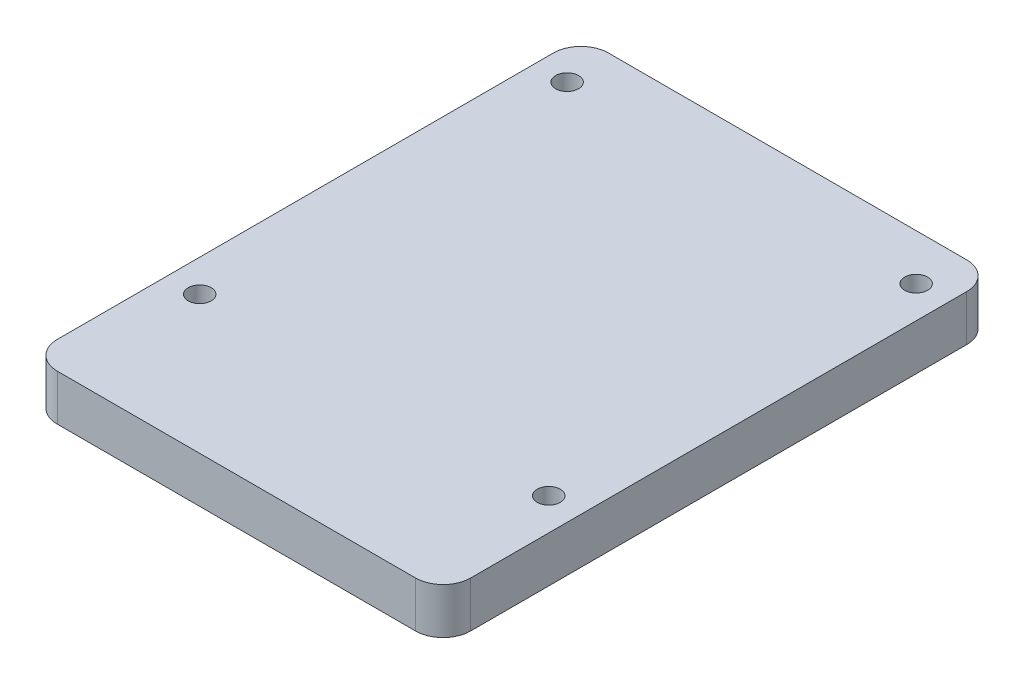
ISO-10303-21;
HEADER;
FILE_DESCRIPTION(('STEP AP214'),'2;1');
FILE_NAME('part.step','',(''),(''),'','','');
FILE_SCHEMA(('AUTOMOTIVE_DESIGN { 1 0 10303 214 1 1 1 1 }'));
ENDSEC;
DATA;
#1=APPLICATION_CONTEXT('core data for automotive mechanical design processes');
#2=APPLICATION_PROTOCOL_DEFINITION('international standard','automotive_design',2000,#1);
#3=PRODUCT_CONTEXT('',#1,'mechanical');
#4=PRODUCT('Part','Part','',(#3));
#5=PRODUCT_RELATED_PRODUCT_CATEGORY('part','',(#4));
#6=PRODUCT_DEFINITION_FORMATION('','',#4);
#7=PRODUCT_DEFINITION_CONTEXT('part definition',#1,'design');
#8=PRODUCT_DEFINITION('design','',#6,#7);
#9=PRODUCT_DEFINITION_SHAPE('','',#8);
#10=(LENGTH_UNIT() NAMED_UNIT(*) SI_UNIT(.MILLI.,.METRE.));
#11=(NAMED_UNIT(*) PLANE_ANGLE_UNIT() SI_UNIT($,.RADIAN.));
#12=(NAMED_UNIT(*) SI_UNIT($,.STERADIAN.) SOLID_ANGLE_UNIT());
#13=UNCERTAINTY_MEASURE_WITH_UNIT(LENGTH_MEASURE(1.E-05),#10,'distance_accuracy_value','');
#14=(GEOMETRIC_REPRESENTATION_CONTEXT(3) GLOBAL_UNCERTAINTY_ASSIGNED_CONTEXT((#13)) GLOBAL_UNIT_ASSIGNED_CONTEXT((#10,
#11,#12)) REPRESENTATION_CONTEXT('',''));
#15=CARTESIAN_POINT('',(0.,0.,0.));
#16=DIRECTION('',(0.,0.,1.));
#17=DIRECTION('',(1.,0.,0.));
#18=AXIS2_PLACEMENT_3D('',#15,#16,#17);
#19=CARTESIAN_POINT('',(0.,5.,0.));
#20=DIRECTION('',(0.,1.,0.));
#21=DIRECTION('',(0.,0.,1.));
#22=AXIS2_PLACEMENT_3D('',#19,#20,#21);
#23=PLANE('',#22);
#24=CARTESIAN_POINT('',(-19.,5.,40.));
#25=DIRECTION('',(0.,1.,0.));
#26=DIRECTION('',(0.,0.,1.));
#27=AXIS2_PLACEMENT_3D('',#24,#25,#26);
#28=CIRCLE('',#27,1.25);
#29=CARTESIAN_POINT('',(-19.,5.,41.25));
#30=VERTEX_POINT('',#29);
#31=EDGE_CURVE('E207',#30,#30,#28,.T.);
#32=ORIENTED_EDGE('',*,*,#31,.F.);
#33=EDGE_LOOP('',(#32));
#34=FACE_BOUND('',#33,.T.);
#35=CARTESIAN_POINT('',(-19.,5.,0.));
#36=DIRECTION('',(0.,1.,0.));
#37=DIRECTION('',(0.,0.,1.));
#38=AXIS2_PLACEMENT_3D('',#35,#36,#37);
#39=CIRCLE('',#38,1.25);
#40=CARTESIAN_POINT('',(-19.,5.,1.25));
#41=VERTEX_POINT('',#40);
#42=EDGE_CURVE('E144',#41,#41,#39,.T.);
#43=ORIENTED_EDGE('',*,*,#42,.F.);
#44=EDGE_LOOP('',(#43));
#45=FACE_BOUND('',#44,.T.);
#46=DIRECTION('',(0.,0.,1.));
#47=VECTOR('',#46,1.);
#48=CARTESIAN_POINT('',(-22.5,5.,-5.));
#49=LINE('',#48,#47);
#50=CARTESIAN_POINT('',(-22.5,5.,-2.));
#51=VERTEX_POINT('',#50);
#52=CARTESIAN_POINT('',(-22.5,5.,52.));
#53=VERTEX_POINT('',#52);
#54=EDGE_CURVE('E150',#51,#53,#49,.T.);
#55=ORIENTED_EDGE('',*,*,#54,.T.);
#56=CARTESIAN_POINT('',(-19.5,5.,52.));
#57=DIRECTION('',(0.,1.,0.));
#58=DIRECTION('',(0.,0.,1.));
#59=AXIS2_PLACEMENT_3D('',#56,#57,#58);
#60=CIRCLE('',#59,3.);
#61=CARTESIAN_POINT('',(-19.5,5.,55.));
#62=VERTEX_POINT('',#61);
#63=EDGE_CURVE('E174',#53,#62,#60,.T.);
#64=ORIENTED_EDGE('',*,*,#63,.T.);
#65=DIRECTION('',(1.,0.,0.));
#66=VECTOR('',#65,1.);
#67=CARTESIAN_POINT('',(-22.5,5.,55.));
#68=LINE('',#67,#66);
#69=CARTESIAN_POINT('',(19.5,5.,55.));
#70=VERTEX_POINT('',#69);
#71=EDGE_CURVE('E127',#62,#70,#68,.T.);
#72=ORIENTED_EDGE('',*,*,#71,.T.);
#73=CARTESIAN_POINT('',(19.5,5.,52.));
#74=DIRECTION('',(0.,1.,0.));
#75=DIRECTION('',(0.,0.,1.));
#76=AXIS2_PLACEMENT_3D('',#73,#74,#75);
#77=CIRCLE('',#76,3.);
#78=CARTESIAN_POINT('',(22.5,5.,52.));
#79=VERTEX_POINT('',#78);
#80=EDGE_CURVE('E171',#70,#79,#77,.T.);
#81=ORIENTED_EDGE('',*,*,#80,.T.);
#82=DIRECTION('',(0.,0.,-1.));
#83=VECTOR('',#82,1.);
#84=CARTESIAN_POINT('',(22.5,5.,55.));
#85=LINE('',#84,#83);
#86=CARTESIAN_POINT('',(22.5,5.,-1.99999999999999));
#87=VERTEX_POINT('',#86);
#88=EDGE_CURVE('E186',#79,#87,#85,.T.);
#89=ORIENTED_EDGE('',*,*,#88,.T.);
#90=CARTESIAN_POINT('',(19.5,5.,-2.));
#91=DIRECTION('',(0.,1.,0.));
#92=DIRECTION('',(0.,0.,1.));
#93=AXIS2_PLACEMENT_3D('',#90,#91,#92);
#94=CIRCLE('',#93,3.);
#95=CARTESIAN_POINT('',(19.5,5.,-5.));
#96=VERTEX_POINT('',#95);
#97=EDGE_CURVE('E61',#87,#96,#94,.T.);
#98=ORIENTED_EDGE('',*,*,#97,.T.);
#99=DIRECTION('',(-1.,0.,0.));
#100=VECTOR('',#99,1.);
#101=CARTESIAN_POINT('',(-22.5,5.,-5.));
#102=LINE('',#101,#100);
#103=CARTESIAN_POINT('',(-19.5,5.,-5.));
#104=VERTEX_POINT('',#103);
#105=EDGE_CURVE('E152',#96,#104,#102,.T.);
#106=ORIENTED_EDGE('',*,*,#105,.T.);
#107=CARTESIAN_POINT('',(-19.5,5.,-2.));
#108=DIRECTION('',(0.,1.,0.));
#109=DIRECTION('',(0.,0.,1.));
#110=AXIS2_PLACEMENT_3D('',#107,#108,#109);
#111=CIRCLE('',#110,3.);
#112=EDGE_CURVE('E166',#104,#51,#111,.T.);
#113=ORIENTED_EDGE('',*,*,#112,.T.);
#114=EDGE_LOOP('',(#55,#64,#72,#81,#89,#98,#106,#113));
#115=FACE_BOUND('',#114,.T.);
#116=CARTESIAN_POINT('',(19.,5.,0.));
#117=DIRECTION('',(0.,1.,0.));
#118=DIRECTION('',(0.,0.,-1.));
#119=AXIS2_PLACEMENT_3D('',#116,#117,#118);
#120=CIRCLE('',#119,1.25);
#121=CARTESIAN_POINT('',(19.,5.,-1.25));
#122=VERTEX_POINT('',#121);
#123=EDGE_CURVE('E199',#122,#122,#120,.T.);
#124=ORIENTED_EDGE('',*,*,#123,.F.);
#125=EDGE_LOOP('',(#124));
#126=FACE_BOUND('',#125,.T.);
#127=CARTESIAN_POINT('',(19.,5.,40.));
#128=DIRECTION('',(0.,1.,0.));
#129=DIRECTION('',(0.,0.,1.));
#130=AXIS2_PLACEMENT_3D('',#127,#128,#129);
#131=CIRCLE('',#130,1.25);
#132=CARTESIAN_POINT('',(19.,5.,41.25));
#133=VERTEX_POINT('',#132);
#134=EDGE_CURVE('E215',#133,#133,#131,.T.);
#135=ORIENTED_EDGE('',*,*,#134,.F.);
#136=EDGE_LOOP('',(#135));
#137=FACE_BOUND('',#136,.T.);
#138=ADVANCED_FACE('F39',(#34,#45,#115,#126,#137),#23,.T.);
#139=CARTESIAN_POINT('',(0.,0.,0.));
#140=DIRECTION('',(0.,1.,0.));
#141=DIRECTION('',(0.,0.,1.));
#142=AXIS2_PLACEMENT_3D('',#139,#140,#141);
#143=PLANE('',#142);
#144=DIRECTION('',(1.,0.,0.));
#145=VECTOR('',#144,1.);
#146=CARTESIAN_POINT('',(-22.5,0.,55.));
#147=LINE('',#146,#145);
#148=CARTESIAN_POINT('',(-19.5,0.,55.));
#149=VERTEX_POINT('',#148);
#150=CARTESIAN_POINT('',(19.5,0.,55.));
#151=VERTEX_POINT('',#150);
#152=EDGE_CURVE('E124',#149,#151,#147,.T.);
#153=ORIENTED_EDGE('',*,*,#152,.F.);
#154=CARTESIAN_POINT('',(-19.5,0.,52.));
#155=DIRECTION('',(0.,1.,0.));
#156=DIRECTION('',(0.,0.,1.));
#157=AXIS2_PLACEMENT_3D('',#154,#155,#156);
#158=CIRCLE('',#157,3.);
#159=CARTESIAN_POINT('',(-22.5,0.,52.));
#160=VERTEX_POINT('',#159);
#161=EDGE_CURVE('E106',#149,#160,#158,.F.);
#162=ORIENTED_EDGE('',*,*,#161,.T.);
#163=DIRECTION('',(0.,0.,1.));
#164=VECTOR('',#163,1.);
#165=CARTESIAN_POINT('',(-22.5,0.,-5.));
#166=LINE('',#165,#164);
#167=CARTESIAN_POINT('',(-22.5,0.,-2.));
#168=VERTEX_POINT('',#167);
#169=EDGE_CURVE('E137',#168,#160,#166,.T.);
#170=ORIENTED_EDGE('',*,*,#169,.F.);
#171=CARTESIAN_POINT('',(-19.5,0.,-2.));
#172=DIRECTION('',(0.,1.,0.));
#173=DIRECTION('',(0.,0.,1.));
#174=AXIS2_PLACEMENT_3D('',#171,#172,#173);
#175=CIRCLE('',#174,3.);
#176=CARTESIAN_POINT('',(-19.5,0.,-5.));
#177=VERTEX_POINT('',#176);
#178=EDGE_CURVE('E129',#168,#177,#175,.F.);
#179=ORIENTED_EDGE('',*,*,#178,.T.);
#180=DIRECTION('',(-1.,0.,0.));
#181=VECTOR('',#180,1.);
#182=CARTESIAN_POINT('',(-22.5,0.,-5.));
#183=LINE('',#182,#181);
#184=CARTESIAN_POINT('',(19.5,0.,-5.));
#185=VERTEX_POINT('',#184);
#186=EDGE_CURVE('E142',#185,#177,#183,.T.);
#187=ORIENTED_EDGE('',*,*,#186,.F.);
#188=CARTESIAN_POINT('',(19.5,0.,-2.));
#189=DIRECTION('',(0.,1.,0.));
#190=DIRECTION('',(0.,0.,1.));
#191=AXIS2_PLACEMENT_3D('',#188,#189,#190);
#192=CIRCLE('',#191,3.);
#193=CARTESIAN_POINT('',(22.5,0.,-1.99999999999999));
#194=VERTEX_POINT('',#193);
#195=EDGE_CURVE('E156',#185,#194,#192,.F.);
#196=ORIENTED_EDGE('',*,*,#195,.T.);
#197=DIRECTION('',(0.,0.,-1.));
#198=VECTOR('',#197,1.);
#199=CARTESIAN_POINT('',(22.5,0.,55.));
#200=LINE('',#199,#198);
#201=CARTESIAN_POINT('',(22.5,0.,52.));
#202=VERTEX_POINT('',#201);
#203=EDGE_CURVE('E136',#202,#194,#200,.T.);
#204=ORIENTED_EDGE('',*,*,#203,.F.);
#205=CARTESIAN_POINT('',(19.5,0.,52.));
#206=DIRECTION('',(0.,1.,0.));
#207=DIRECTION('',(0.,0.,1.));
#208=AXIS2_PLACEMENT_3D('',#205,#206,#207);
#209=CIRCLE('',#208,3.);
#210=EDGE_CURVE('E118',#202,#151,#209,.F.);
#211=ORIENTED_EDGE('',*,*,#210,.T.);
#212=EDGE_LOOP('',(#153,#162,#170,#179,#187,#196,#204,#211));
#213=FACE_BOUND('',#212,.T.);
#214=CARTESIAN_POINT('',(-19.,0.,0.));
#215=DIRECTION('',(0.,1.,0.));
#216=DIRECTION('',(0.,0.,1.));
#217=AXIS2_PLACEMENT_3D('',#214,#215,#216);
#218=CIRCLE('',#217,1.25);
#219=CARTESIAN_POINT('',(-19.,0.,1.25));
#220=VERTEX_POINT('',#219);
#221=EDGE_CURVE('E195',#220,#220,#218,.T.);
#222=ORIENTED_EDGE('',*,*,#221,.T.);
#223=EDGE_LOOP('',(#222));
#224=FACE_BOUND('',#223,.T.);
#225=CARTESIAN_POINT('',(19.,0.,0.));
#226=DIRECTION('',(0.,1.,0.));
#227=DIRECTION('',(0.,0.,-1.));
#228=AXIS2_PLACEMENT_3D('',#225,#226,#227);
#229=CIRCLE('',#228,1.25);
#230=CARTESIAN_POINT('',(19.,0.,-1.25));
#231=VERTEX_POINT('',#230);
#232=EDGE_CURVE('E203',#231,#231,#229,.T.);
#233=ORIENTED_EDGE('',*,*,#232,.T.);
#234=EDGE_LOOP('',(#233));
#235=FACE_BOUND('',#234,.T.);
#236=CARTESIAN_POINT('',(-19.,0.,40.));
#237=DIRECTION('',(0.,1.,0.));
#238=DIRECTION('',(0.,0.,1.));
#239=AXIS2_PLACEMENT_3D('',#236,#237,#238);
#240=CIRCLE('',#239,1.25);
#241=CARTESIAN_POINT('',(-19.,0.,41.25));
#242=VERTEX_POINT('',#241);
#243=EDGE_CURVE('E211',#242,#242,#240,.T.);
#244=ORIENTED_EDGE('',*,*,#243,.T.);
#245=EDGE_LOOP('',(#244));
#246=FACE_BOUND('',#245,.T.);
#247=CARTESIAN_POINT('',(19.,0.,40.));
#248=DIRECTION('',(0.,1.,0.));
#249=DIRECTION('',(0.,0.,1.));
#250=AXIS2_PLACEMENT_3D('',#247,#248,#249);
#251=CIRCLE('',#250,1.25);
#252=CARTESIAN_POINT('',(19.,0.,41.25));
#253=VERTEX_POINT('',#252);
#254=EDGE_CURVE('E219',#253,#253,#251,.T.);
#255=ORIENTED_EDGE('',*,*,#254,.T.);
#256=EDGE_LOOP('',(#255));
#257=FACE_BOUND('',#256,.T.);
#258=ADVANCED_FACE('F132',(#213,#224,#235,#246,#257),#143,.F.);
#259=CARTESIAN_POINT('',(-22.5,5.,-5.));
#260=DIRECTION('',(1.,0.,0.));
#261=DIRECTION('',(0.,0.,-1.));
#262=AXIS2_PLACEMENT_3D('',#259,#260,#261);
#263=PLANE('',#262);
#264=ORIENTED_EDGE('',*,*,#169,.T.);
#265=DIRECTION('',(0.,-1.,0.));
#266=VECTOR('',#265,1.);
#267=CARTESIAN_POINT('',(-22.5,5.,52.));
#268=LINE('',#267,#266);
#269=EDGE_CURVE('E111',#160,#53,#268,.F.);
#270=ORIENTED_EDGE('',*,*,#269,.T.);
#271=ORIENTED_EDGE('',*,*,#54,.F.);
#272=DIRECTION('',(0.,-1.,0.));
#273=VECTOR('',#272,1.);
#274=CARTESIAN_POINT('',(-22.5,5.,-2.));
#275=LINE('',#274,#273);
#276=EDGE_CURVE('E117',#51,#168,#275,.T.);
#277=ORIENTED_EDGE('',*,*,#276,.T.);
#278=EDGE_LOOP('',(#264,#270,#271,#277));
#279=FACE_BOUND('',#278,.T.);
#280=ADVANCED_FACE('F236',(#279),#263,.F.);
#281=CARTESIAN_POINT('',(-22.5,5.,55.));
#282=DIRECTION('',(0.,0.,-1.));
#283=DIRECTION('',(-1.,0.,0.));
#284=AXIS2_PLACEMENT_3D('',#281,#282,#283);
#285=PLANE('',#284);
#286=ORIENTED_EDGE('',*,*,#71,.F.);
#287=DIRECTION('',(0.,-1.,0.));
#288=VECTOR('',#287,1.);
#289=CARTESIAN_POINT('',(-19.5,5.,55.));
#290=LINE('',#289,#288);
#291=EDGE_CURVE('E110',#62,#149,#290,.T.);
#292=ORIENTED_EDGE('',*,*,#291,.T.);
#293=ORIENTED_EDGE('',*,*,#152,.T.);
#294=DIRECTION('',(0.,-1.,0.));
#295=VECTOR('',#294,1.);
#296=CARTESIAN_POINT('',(19.5,5.,55.));
#297=LINE('',#296,#295);
#298=EDGE_CURVE('E130',#151,#70,#297,.F.);
#299=ORIENTED_EDGE('',*,*,#298,.T.);
#300=EDGE_LOOP('',(#286,#292,#293,#299));
#301=FACE_BOUND('',#300,.T.);
#302=ADVANCED_FACE('F123',(#301),#285,.F.);
#303=CARTESIAN_POINT('',(22.5,5.,55.));
#304=DIRECTION('',(-1.,0.,0.));
#305=DIRECTION('',(0.,0.,1.));
#306=AXIS2_PLACEMENT_3D('',#303,#304,#305);
#307=PLANE('',#306);
#308=ORIENTED_EDGE('',*,*,#88,.F.);
#309=DIRECTION('',(0.,-1.,0.));
#310=VECTOR('',#309,1.);
#311=CARTESIAN_POINT('',(22.5,5.,52.));
#312=LINE('',#311,#310);
#313=EDGE_CURVE('E180',#79,#202,#312,.T.);
#314=ORIENTED_EDGE('',*,*,#313,.T.);
#315=ORIENTED_EDGE('',*,*,#203,.T.);
#316=DIRECTION('',(0.,-1.,0.));
#317=VECTOR('',#316,1.);
#318=CARTESIAN_POINT('',(22.5,5.,-2.));
#319=LINE('',#318,#317);
#320=EDGE_CURVE('E177',#194,#87,#319,.F.);
#321=ORIENTED_EDGE('',*,*,#320,.T.);
#322=EDGE_LOOP('',(#308,#314,#315,#321));
#323=FACE_BOUND('',#322,.T.);
#324=ADVANCED_FACE('F247',(#323),#307,.F.);
#325=CARTESIAN_POINT('',(-22.5,5.,-5.));
#326=DIRECTION('',(0.,0.,1.));
#327=DIRECTION('',(1.,0.,0.));
#328=AXIS2_PLACEMENT_3D('',#325,#326,#327);
#329=PLANE('',#328);
#330=ORIENTED_EDGE('',*,*,#105,.F.);
#331=DIRECTION('',(0.,-1.,0.));
#332=VECTOR('',#331,1.);
#333=CARTESIAN_POINT('',(19.5,5.,-5.));
#334=LINE('',#333,#332);
#335=EDGE_CURVE('E11',#96,#185,#334,.T.);
#336=ORIENTED_EDGE('',*,*,#335,.T.);
#337=ORIENTED_EDGE('',*,*,#186,.T.);
#338=DIRECTION('',(0.,-1.,0.));
#339=VECTOR('',#338,1.);
#340=CARTESIAN_POINT('',(-19.5,5.,-5.));
#341=LINE('',#340,#339);
#342=EDGE_CURVE('E48',#177,#104,#341,.F.);
#343=ORIENTED_EDGE('',*,*,#342,.T.);
#344=EDGE_LOOP('',(#330,#336,#337,#343));
#345=FACE_BOUND('',#344,.T.);
#346=ADVANCED_FACE('F244',(#345),#329,.F.);
#347=CARTESIAN_POINT('',(-19.,5.,0.));
#348=DIRECTION('',(0.,-1.,0.));
#349=DIRECTION('',(0.,0.,-1.));
#350=AXIS2_PLACEMENT_3D('',#347,#348,#349);
#351=CYLINDRICAL_SURFACE('',#350,1.25);
#352=ORIENTED_EDGE('',*,*,#42,.T.);
#353=EDGE_LOOP('',(#352));
#354=FACE_BOUND('',#353,.T.);
#355=ORIENTED_EDGE('',*,*,#221,.F.);
#356=EDGE_LOOP('',(#355));
#357=FACE_BOUND('',#356,.T.);
#358=ADVANCED_FACE('F241',(#354,#357),#351,.F.);
#359=CARTESIAN_POINT('',(19.,5.,0.));
#360=DIRECTION('',(0.,-1.,0.));
#361=DIRECTION('',(0.,0.,-1.));
#362=AXIS2_PLACEMENT_3D('',#359,#360,#361);
#363=CYLINDRICAL_SURFACE('',#362,1.25);
#364=ORIENTED_EDGE('',*,*,#123,.T.);
#365=EDGE_LOOP('',(#364));
#366=FACE_BOUND('',#365,.T.);
#367=ORIENTED_EDGE('',*,*,#232,.F.);
#368=EDGE_LOOP('',(#367));
#369=FACE_BOUND('',#368,.T.);
#370=ADVANCED_FACE('F276',(#366,#369),#363,.F.);
#371=CARTESIAN_POINT('',(-19.,5.,40.));
#372=DIRECTION('',(0.,-1.,0.));
#373=DIRECTION('',(0.,0.,-1.));
#374=AXIS2_PLACEMENT_3D('',#371,#372,#373);
#375=CYLINDRICAL_SURFACE('',#374,1.25);
#376=ORIENTED_EDGE('',*,*,#31,.T.);
#377=EDGE_LOOP('',(#376));
#378=FACE_BOUND('',#377,.T.);
#379=ORIENTED_EDGE('',*,*,#243,.F.);
#380=EDGE_LOOP('',(#379));
#381=FACE_BOUND('',#380,.T.);
#382=ADVANCED_FACE('F279',(#378,#381),#375,.F.);
#383=CARTESIAN_POINT('',(19.,5.,40.));
#384=DIRECTION('',(0.,-1.,0.));
#385=DIRECTION('',(0.,0.,-1.));
#386=AXIS2_PLACEMENT_3D('',#383,#384,#385);
#387=CYLINDRICAL_SURFACE('',#386,1.25);
#388=ORIENTED_EDGE('',*,*,#134,.T.);
#389=EDGE_LOOP('',(#388));
#390=FACE_BOUND('',#389,.T.);
#391=ORIENTED_EDGE('',*,*,#254,.F.);
#392=EDGE_LOOP('',(#391));
#393=FACE_BOUND('',#392,.T.);
#394=ADVANCED_FACE('F227',(#390,#393),#387,.F.);
#395=CARTESIAN_POINT('',(-19.5,5.,52.));
#396=DIRECTION('',(0.,-1.,0.));
#397=DIRECTION('',(0.,0.,-1.));
#398=AXIS2_PLACEMENT_3D('',#395,#396,#397);
#399=CYLINDRICAL_SURFACE('',#398,3.);
#400=ORIENTED_EDGE('',*,*,#63,.F.);
#401=ORIENTED_EDGE('',*,*,#269,.F.);
#402=ORIENTED_EDGE('',*,*,#161,.F.);
#403=ORIENTED_EDGE('',*,*,#291,.F.);
#404=EDGE_LOOP('',(#400,#401,#402,#403));
#405=FACE_BOUND('',#404,.T.);
#406=ADVANCED_FACE('F109',(#405),#399,.T.);
#407=CARTESIAN_POINT('',(19.5,5.,52.));
#408=DIRECTION('',(0.,-1.,0.));
#409=DIRECTION('',(0.,0.,-1.));
#410=AXIS2_PLACEMENT_3D('',#407,#408,#409);
#411=CYLINDRICAL_SURFACE('',#410,3.);
#412=ORIENTED_EDGE('',*,*,#80,.F.);
#413=ORIENTED_EDGE('',*,*,#298,.F.);
#414=ORIENTED_EDGE('',*,*,#210,.F.);
#415=ORIENTED_EDGE('',*,*,#313,.F.);
#416=EDGE_LOOP('',(#412,#413,#414,#415));
#417=FACE_BOUND('',#416,.T.);
#418=ADVANCED_FACE('F258',(#417),#411,.T.);
#419=CARTESIAN_POINT('',(19.5,5.,-2.));
#420=DIRECTION('',(0.,-1.,0.));
#421=DIRECTION('',(0.,0.,-1.));
#422=AXIS2_PLACEMENT_3D('',#419,#420,#421);
#423=CYLINDRICAL_SURFACE('',#422,3.);
#424=ORIENTED_EDGE('',*,*,#97,.F.);
#425=ORIENTED_EDGE('',*,*,#320,.F.);
#426=ORIENTED_EDGE('',*,*,#195,.F.);
#427=ORIENTED_EDGE('',*,*,#335,.F.);
#428=EDGE_LOOP('',(#424,#425,#426,#427));
#429=FACE_BOUND('',#428,.T.);
#430=ADVANCED_FACE('F260',(#429),#423,.T.);
#431=CARTESIAN_POINT('',(-19.5,5.,-2.));
#432=DIRECTION('',(0.,-1.,0.));
#433=DIRECTION('',(0.,0.,-1.));
#434=AXIS2_PLACEMENT_3D('',#431,#432,#433);
#435=CYLINDRICAL_SURFACE('',#434,3.);
#436=ORIENTED_EDGE('',*,*,#112,.F.);
#437=ORIENTED_EDGE('',*,*,#342,.F.);
#438=ORIENTED_EDGE('',*,*,#178,.F.);
#439=ORIENTED_EDGE('',*,*,#276,.F.);
#440=EDGE_LOOP('',(#436,#437,#438,#439));
#441=FACE_BOUND('',#440,.T.);
#442=ADVANCED_FACE('F41',(#441),#435,.T.);
#443=CLOSED_SHELL('',(#138,#258,#280,#302,#324,#346,#358,#370,#382,#394,#406,#418,#430,#442));
#444=MANIFOLD_SOLID_BREP('B2',#443);
#445=ADVANCED_BREP_SHAPE_REPRESENTATION('',(#18,#444),#14);
#446=SHAPE_DEFINITION_REPRESENTATION(#9,#445);
ENDSEC;
END-ISO-10303-21;
